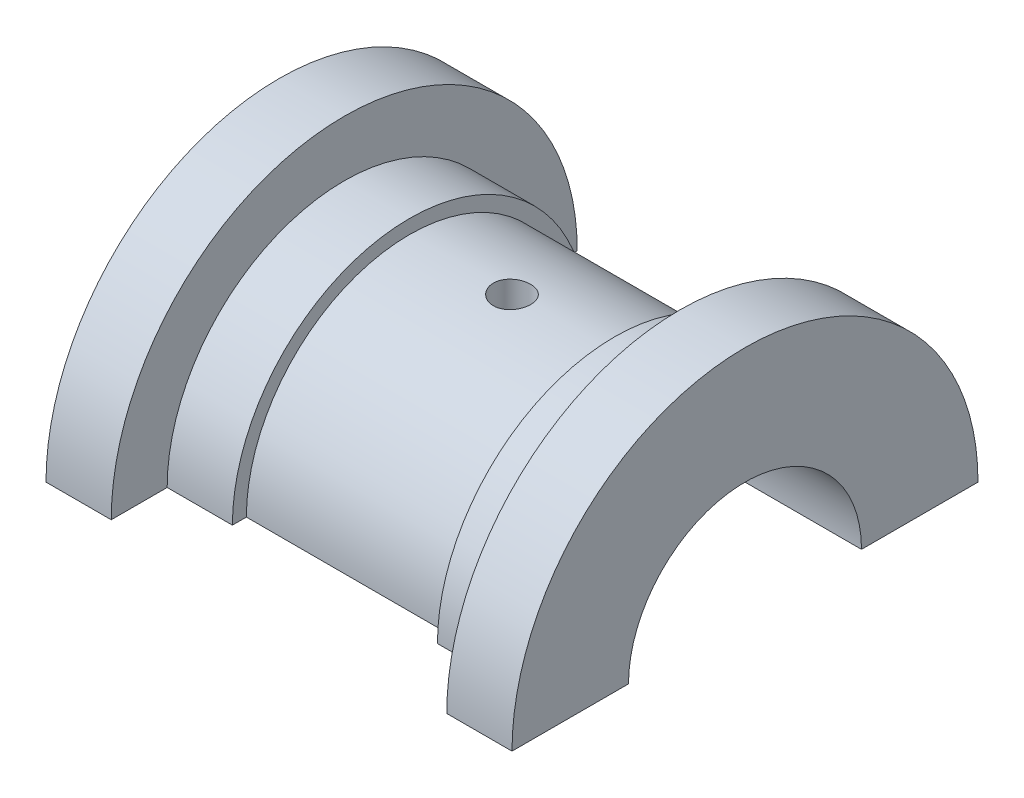
ISO-10303-21;
HEADER;
FILE_DESCRIPTION(('STEP AP214'),'2;1');
FILE_NAME('part.step','',(''),(''),'','','');
FILE_SCHEMA(('AUTOMOTIVE_DESIGN { 1 0 10303 214 1 1 1 1 }'));
ENDSEC;
DATA;
#1=APPLICATION_CONTEXT('core data for automotive mechanical design processes');
#2=APPLICATION_PROTOCOL_DEFINITION('international standard','automotive_design',2000,#1);
#3=PRODUCT_CONTEXT('',#1,'mechanical');
#4=PRODUCT('Part','Part','',(#3));
#5=PRODUCT_RELATED_PRODUCT_CATEGORY('part','',(#4));
#6=PRODUCT_DEFINITION_FORMATION('','',#4);
#7=PRODUCT_DEFINITION_CONTEXT('part definition',#1,'design');
#8=PRODUCT_DEFINITION('design','',#6,#7);
#9=PRODUCT_DEFINITION_SHAPE('','',#8);
#10=(LENGTH_UNIT() NAMED_UNIT(*) SI_UNIT(.MILLI.,.METRE.));
#11=(NAMED_UNIT(*) PLANE_ANGLE_UNIT() SI_UNIT($,.RADIAN.));
#12=(NAMED_UNIT(*) SI_UNIT($,.STERADIAN.) SOLID_ANGLE_UNIT());
#13=UNCERTAINTY_MEASURE_WITH_UNIT(LENGTH_MEASURE(1.E-05),#10,'distance_accuracy_value','');
#14=(GEOMETRIC_REPRESENTATION_CONTEXT(3) GLOBAL_UNCERTAINTY_ASSIGNED_CONTEXT((#13)) GLOBAL_UNIT_ASSIGNED_CONTEXT((#10,
#11,#12)) REPRESENTATION_CONTEXT('',''));
#15=CARTESIAN_POINT('',(0.,0.,0.));
#16=DIRECTION('',(0.,0.,1.));
#17=DIRECTION('',(1.,0.,0.));
#18=AXIS2_PLACEMENT_3D('',#15,#16,#17);
#19=CARTESIAN_POINT('',(25.,0.,0.));
#20=DIRECTION('',(-1.,0.,0.));
#21=DIRECTION('',(0.,0.,1.));
#22=AXIS2_PLACEMENT_3D('',#19,#20,#21);
#23=PLANE('',#22);
#24=CARTESIAN_POINT('',(25.,0.,0.));
#25=DIRECTION('',(-1.,0.,0.));
#26=DIRECTION('',(0.,0.,1.));
#27=AXIS2_PLACEMENT_3D('',#24,#25,#26);
#28=CIRCLE('',#27,25.);
#29=CARTESIAN_POINT('',(25.,0.,25.));
#30=VERTEX_POINT('',#29);
#31=CARTESIAN_POINT('',(25.,0.,-25.));
#32=VERTEX_POINT('',#31);
#33=EDGE_CURVE('E151',#30,#32,#28,.T.);
#34=ORIENTED_EDGE('',*,*,#33,.F.);
#35=DIRECTION('',(0.,0.,-1.));
#36=VECTOR('',#35,1.);
#37=CARTESIAN_POINT('',(25.,0.,0.));
#38=LINE('',#37,#36);
#39=CARTESIAN_POINT('',(25.,0.,12.5));
#40=VERTEX_POINT('',#39);
#41=EDGE_CURVE('E156',#30,#40,#38,.T.);
#42=ORIENTED_EDGE('',*,*,#41,.T.);
#43=CARTESIAN_POINT('',(25.,0.,0.));
#44=DIRECTION('',(1.,0.,0.));
#45=DIRECTION('',(0.,0.,-1.));
#46=AXIS2_PLACEMENT_3D('',#43,#44,#45);
#47=CIRCLE('',#46,12.5);
#48=CARTESIAN_POINT('',(25.,0.,-12.5));
#49=VERTEX_POINT('',#48);
#50=EDGE_CURVE('E153',#49,#40,#47,.T.);
#51=ORIENTED_EDGE('',*,*,#50,.F.);
#52=EDGE_CURVE('E64',#49,#32,#38,.T.);
#53=ORIENTED_EDGE('',*,*,#52,.T.);
#54=EDGE_LOOP('',(#34,#42,#51,#53));
#55=FACE_BOUND('',#54,.T.);
#56=ADVANCED_FACE('F43',(#55),#23,.F.);
#57=CARTESIAN_POINT('',(-25.,0.,0.));
#58=DIRECTION('',(-1.,0.,0.));
#59=DIRECTION('',(0.,0.,1.));
#60=AXIS2_PLACEMENT_3D('',#57,#58,#59);
#61=CYLINDRICAL_SURFACE('',#60,25.);
#62=ORIENTED_EDGE('',*,*,#33,.T.);
#63=DIRECTION('',(-1.,0.,0.));
#64=VECTOR('',#63,1.);
#65=CARTESIAN_POINT('',(133.253175473055,0.,-25.));
#66=LINE('',#65,#64);
#67=CARTESIAN_POINT('',(18.,0.,-25.));
#68=VERTEX_POINT('',#67);
#69=EDGE_CURVE('E135',#32,#68,#66,.T.);
#70=ORIENTED_EDGE('',*,*,#69,.T.);
#71=CARTESIAN_POINT('',(18.,0.,0.));
#72=DIRECTION('',(-1.,0.,0.));
#73=DIRECTION('',(0.,0.,1.));
#74=AXIS2_PLACEMENT_3D('',#71,#72,#73);
#75=CIRCLE('',#74,25.);
#76=CARTESIAN_POINT('',(18.,0.,25.));
#77=VERTEX_POINT('',#76);
#78=EDGE_CURVE('E161',#77,#68,#75,.T.);
#79=ORIENTED_EDGE('',*,*,#78,.F.);
#80=DIRECTION('',(-1.,0.,0.));
#81=VECTOR('',#80,1.);
#82=CARTESIAN_POINT('',(133.253175473055,0.,25.));
#83=LINE('',#82,#81);
#84=EDGE_CURVE('E159',#30,#77,#83,.T.);
#85=ORIENTED_EDGE('',*,*,#84,.F.);
#86=EDGE_LOOP('',(#62,#70,#79,#85));
#87=FACE_BOUND('',#86,.T.);
#88=ADVANCED_FACE('F158',(#87),#61,.T.);
#89=CARTESIAN_POINT('',(18.,25.,0.));
#90=DIRECTION('',(1.,0.,0.));
#91=DIRECTION('',(0.,0.,-1.));
#92=AXIS2_PLACEMENT_3D('',#89,#90,#91);
#93=PLANE('',#92);
#94=ORIENTED_EDGE('',*,*,#78,.T.);
#95=DIRECTION('',(0.,0.,1.));
#96=VECTOR('',#95,1.);
#97=CARTESIAN_POINT('',(18.,0.,0.));
#98=LINE('',#97,#96);
#99=CARTESIAN_POINT('',(18.,0.,-19.));
#100=VERTEX_POINT('',#99);
#101=EDGE_CURVE('E138',#68,#100,#98,.T.);
#102=ORIENTED_EDGE('',*,*,#101,.T.);
#103=CARTESIAN_POINT('',(18.,0.,0.));
#104=DIRECTION('',(-1.,0.,0.));
#105=DIRECTION('',(0.,0.,1.));
#106=AXIS2_PLACEMENT_3D('',#103,#104,#105);
#107=CIRCLE('',#106,19.);
#108=CARTESIAN_POINT('',(18.,0.,19.));
#109=VERTEX_POINT('',#108);
#110=EDGE_CURVE('E166',#109,#100,#107,.T.);
#111=ORIENTED_EDGE('',*,*,#110,.F.);
#112=EDGE_CURVE('E203',#109,#77,#98,.T.);
#113=ORIENTED_EDGE('',*,*,#112,.T.);
#114=EDGE_LOOP('',(#94,#102,#111,#113));
#115=FACE_BOUND('',#114,.T.);
#116=ADVANCED_FACE('F308',(#115),#93,.F.);
#117=CARTESIAN_POINT('',(-25.,0.,0.));
#118=DIRECTION('',(-1.,0.,0.));
#119=DIRECTION('',(0.,0.,1.));
#120=AXIS2_PLACEMENT_3D('',#117,#118,#119);
#121=CYLINDRICAL_SURFACE('',#120,19.);
#122=ORIENTED_EDGE('',*,*,#110,.T.);
#123=DIRECTION('',(-1.,0.,0.));
#124=VECTOR('',#123,1.);
#125=CARTESIAN_POINT('',(-25.,0.,-19.));
#126=LINE('',#125,#124);
#127=CARTESIAN_POINT('',(11.,0.,-19.));
#128=VERTEX_POINT('',#127);
#129=EDGE_CURVE('E224',#100,#128,#126,.T.);
#130=ORIENTED_EDGE('',*,*,#129,.T.);
#131=CARTESIAN_POINT('',(11.,0.,0.));
#132=DIRECTION('',(-1.,0.,0.));
#133=DIRECTION('',(0.,0.,1.));
#134=AXIS2_PLACEMENT_3D('',#131,#132,#133);
#135=CIRCLE('',#134,19.);
#136=CARTESIAN_POINT('',(11.,0.,19.));
#137=VERTEX_POINT('',#136);
#138=EDGE_CURVE('E172',#137,#128,#135,.T.);
#139=ORIENTED_EDGE('',*,*,#138,.F.);
#140=DIRECTION('',(-1.,0.,0.));
#141=VECTOR('',#140,1.);
#142=CARTESIAN_POINT('',(-25.,0.,19.));
#143=LINE('',#142,#141);
#144=EDGE_CURVE('E207',#137,#109,#143,.F.);
#145=ORIENTED_EDGE('',*,*,#144,.T.);
#146=EDGE_LOOP('',(#122,#130,#139,#145));
#147=FACE_BOUND('',#146,.T.);
#148=ADVANCED_FACE('F312',(#147),#121,.T.);
#149=CARTESIAN_POINT('',(11.,19.,0.));
#150=DIRECTION('',(1.,0.,0.));
#151=DIRECTION('',(0.,0.,-1.));
#152=AXIS2_PLACEMENT_3D('',#149,#150,#151);
#153=PLANE('',#152);
#154=ORIENTED_EDGE('',*,*,#138,.T.);
#155=DIRECTION('',(0.,0.,1.));
#156=VECTOR('',#155,1.);
#157=CARTESIAN_POINT('',(11.,0.,0.));
#158=LINE('',#157,#156);
#159=CARTESIAN_POINT('',(11.,0.,-17.5));
#160=VERTEX_POINT('',#159);
#161=EDGE_CURVE('E228',#128,#160,#158,.T.);
#162=ORIENTED_EDGE('',*,*,#161,.T.);
#163=CARTESIAN_POINT('',(11.,0.,0.));
#164=DIRECTION('',(-1.,0.,0.));
#165=DIRECTION('',(0.,0.,1.));
#166=AXIS2_PLACEMENT_3D('',#163,#164,#165);
#167=CIRCLE('',#166,17.5);
#168=CARTESIAN_POINT('',(11.,0.,17.5));
#169=VERTEX_POINT('',#168);
#170=EDGE_CURVE('E176',#169,#160,#167,.T.);
#171=ORIENTED_EDGE('',*,*,#170,.F.);
#172=EDGE_CURVE('E211',#169,#137,#158,.T.);
#173=ORIENTED_EDGE('',*,*,#172,.T.);
#174=EDGE_LOOP('',(#154,#162,#171,#173));
#175=FACE_BOUND('',#174,.T.);
#176=ADVANCED_FACE('F301',(#175),#153,.F.);
#177=CARTESIAN_POINT('',(-25.,0.,0.));
#178=DIRECTION('',(-1.,0.,0.));
#179=DIRECTION('',(0.,0.,1.));
#180=AXIS2_PLACEMENT_3D('',#177,#178,#179);
#181=CYLINDRICAL_SURFACE('',#180,17.5);
#182=CARTESIAN_POINT('',(0.,17.3853386507137,2.));
#183=CARTESIAN_POINT('',(-0.111946589372524,17.3853401353315,1.99999519733595));
#184=CARTESIAN_POINT('',(-0.223964994921923,17.3864315751054,1.99056928251642));
#185=CARTESIAN_POINT('',(-0.444889671697474,17.3906782331753,1.95311344773096));
#186=CARTESIAN_POINT('',(-0.553792479503966,17.3938356616542,1.92506360351944));
#187=CARTESIAN_POINT('',(-0.765255030279527,17.4018520931882,1.85119296589626));
#188=CARTESIAN_POINT('',(-0.867818819285595,17.4067099973959,1.80538364660709));
#189=CARTESIAN_POINT('',(-1.06378206604588,17.4175786814491,1.6973178849601));
#190=CARTESIAN_POINT('',(-1.15718320126785,17.423589249671,1.6350644608687));
#191=CARTESIAN_POINT('',(-1.33262956371172,17.4361176819346,1.49556368835386));
#192=CARTESIAN_POINT('',(-1.41462552791579,17.4426375676046,1.41825455823809));
#193=CARTESIAN_POINT('',(-1.56450902249383,17.4554317583341,1.25096954824277));
#194=CARTESIAN_POINT('',(-1.63239587710581,17.4617060516193,1.16099306200071));
#195=CARTESIAN_POINT('',(-1.75230824059131,17.4733225280882,0.970620910263635));
#196=CARTESIAN_POINT('',(-1.80428955803743,17.4786620969871,0.870197236204718));
#197=CARTESIAN_POINT('',(-1.89063240605875,17.4877853680334,0.66197497320992));
#198=CARTESIAN_POINT('',(-1.9249944880326,17.4915691188697,0.554176615186415));
#199=CARTESIAN_POINT('',(-1.97497734252851,17.4971402074226,0.334766558288023));
#200=CARTESIAN_POINT('',(-1.99067964857446,17.4989362281041,0.223173657194598));
#201=CARTESIAN_POINT('',(-2.00314972142082,17.5003590938998,-0.00107691382555894));
#202=CARTESIAN_POINT('',(-1.99991811760643,17.4999860111176,-0.11373454823503));
#203=CARTESIAN_POINT('',(-1.9746778272773,17.497119767547,-0.33636248784968));
#204=CARTESIAN_POINT('',(-1.95275682041612,17.4946365066491,-0.44634287900327));
#205=CARTESIAN_POINT('',(-1.89089682950376,17.487840154992,-0.661053445479786));
#206=CARTESIAN_POINT('',(-1.85095755129325,17.4835270343592,-0.765783535057301));
#207=CARTESIAN_POINT('',(-1.75410019097594,17.4735386514763,-0.967294288035754));
#208=CARTESIAN_POINT('',(-1.69714377600709,17.4678603196472,-1.06405636819045));
#209=CARTESIAN_POINT('',(-1.56789678444337,17.4557776619181,-1.24668163917683));
#210=CARTESIAN_POINT('',(-1.49560561983236,17.449373308183,-1.33254441186903));
#211=CARTESIAN_POINT('',(-1.33724919448781,17.436513040988,-1.49144815236604));
#212=CARTESIAN_POINT('',(-1.25110758210007,17.4300570420279,-1.56441304576845));
#213=CARTESIAN_POINT('',(-1.0677588923309,17.4178574111694,-1.69485961446738));
#214=CARTESIAN_POINT('',(-0.970551789715114,17.4121137808956,-1.75234125445402));
#215=CARTESIAN_POINT('',(-0.767767939743451,17.4019890438088,-1.85019181534949));
#216=CARTESIAN_POINT('',(-0.662188535919723,17.3976083716403,-1.89055527879404));
#217=CARTESIAN_POINT('',(-0.445689423466888,17.3907142897617,-1.95295957446188));
#218=CARTESIAN_POINT('',(-0.334769928945009,17.3882008052541,-1.97500114064275));
#219=CARTESIAN_POINT('',(-0.111409276007052,17.3853390699854,-2.00003653434785));
#220=CARTESIAN_POINT('',(0.00101976549901354,17.384978682311,-2.00313713351255));
#221=CARTESIAN_POINT('',(0.224795725911944,17.3864318824203,-1.99048370024868));
#222=CARTESIAN_POINT('',(0.336142663982755,17.3882454316329,-1.97473000234356));
#223=CARTESIAN_POINT('',(0.554277710431837,17.3938311078367,-1.92490480743124));
#224=CARTESIAN_POINT('',(0.661077653557209,17.3975977651037,-1.89088445720912));
#225=CARTESIAN_POINT('',(0.867456208856069,17.4066608217964,-1.8055441206904));
#226=CARTESIAN_POINT('',(0.967034606989831,17.4119572665405,-1.75422362188829));
#227=CARTESIAN_POINT('',(1.15662812006314,17.4235123453982,-1.63547501760195));
#228=CARTESIAN_POINT('',(1.24659891285623,17.4297751382952,-1.56797655870491));
#229=CARTESIAN_POINT('',(1.41397230825862,17.442543959092,-1.41888814821184));
#230=CARTESIAN_POINT('',(1.49137450327603,17.4490499948718,-1.33729773979956));
#231=CARTESIAN_POINT('',(1.63178548317454,17.4616092377758,-1.16187651855541));
#232=CARTESIAN_POINT('',(1.69472433770165,17.4676601534551,-1.06798954470542));
#233=CARTESIAN_POINT('',(1.80393937919364,17.4785935486018,-0.870915351390361));
#234=CARTESIAN_POINT('',(1.8502158540187,17.4834760482544,-0.76772829263257));
#235=CARTESIAN_POINT('',(1.92467566123988,17.4915122431867,-0.555220730050709));
#236=CARTESIAN_POINT('',(1.95290023506191,17.4946698766728,-0.445914831710694));
#237=CARTESIAN_POINT('',(1.99058941951927,17.498916830849,-0.224077216219368));
#238=CARTESIAN_POINT('',(2.00005473054384,17.5000062287579,-0.111545619660739));
#239=CARTESIAN_POINT('',(1.99994510250234,17.4999937520126,0.112864401253133));
#240=CARTESIAN_POINT('',(1.99047832045056,17.4989043247502,0.224742894695049));
#241=CARTESIAN_POINT('',(1.95300127134245,17.4946812487719,0.445308378800854));
#242=CARTESIAN_POINT('',(1.92499100344009,17.4915475999627,0.553995369319134));
#243=CARTESIAN_POINT('',(1.85125428527817,17.4835868311737,0.765084431079245));
#244=CARTESIAN_POINT('',(1.80553211653411,17.478760120486,0.867488014290727));
#245=CARTESIAN_POINT('',(1.69768073352085,17.4679493137143,1.0631853726956));
#246=CARTESIAN_POINT('',(1.63555145524283,17.4619652131149,1.15647911234695));
#247=CARTESIAN_POINT('',(1.49624648821104,17.4494678477128,1.33186210611053));
#248=CARTESIAN_POINT('',(1.41899021819487,17.4429518630308,1.41388716420689));
#249=CARTESIAN_POINT('',(1.25178901681435,17.4301475365176,1.5638533009412));
#250=CARTESIAN_POINT('',(1.16184106815131,17.4238592492669,1.63179102096622));
#251=CARTESIAN_POINT('',(0.971480376349264,17.4122005213082,1.75183717616198));
#252=CARTESIAN_POINT('',(0.87103460063765,17.4068331273112,1.80389349456594));
#253=CARTESIAN_POINT('',(0.662825662631923,17.3976597913728,1.89032803888977));
#254=CARTESIAN_POINT('',(0.555070743865215,17.3938521233529,1.92472581745879));
#255=CARTESIAN_POINT('',(0.372277873121076,17.3891702575432,1.96647476380521));
#256=CARTESIAN_POINT('',(0.298400454831266,17.3877403947785,1.9790290620281));
#257=CARTESIAN_POINT('',(0.149692726088288,17.3858240977585,1.99579326119775));
#258=CARTESIAN_POINT('',(0.0748624212969904,17.3853376579002,2.00000321170177));
#259=CARTESIAN_POINT('',(0.,17.3853386507137,2.));
#260=B_SPLINE_CURVE_WITH_KNOTS('',3,(#182,#183,#184,#185,#186,#187,#188,#189,#190,#191,#192,
#193,#194,#195,#196,#197,#198,#199,#200,#201,#202,#203,#204,#205,#206,#207,#208,#209,#210,#211,
#212,#213,#214,#215,#216,#217,#218,#219,#220,#221,#222,#223,#224,#225,#226,#227,#228,#229,#230,
#231,#232,#233,#234,#235,#236,#237,#238,#239,#240,#241,#242,#243,#244,#245,#246,#247,#248,#249,
#250,#251,#252,#253,#254,#255,#256,#257,#258,#259),.UNSPECIFIED.,.T.,.F.,(4,2,2,2,2,2,2,2,2,2,2,
2,2,2,2,2,2,2,2,2,2,2,2,2,2,2,2,2,2,2,2,2,2,2,2,2,2,2,4),(0.,0.335566330669862,
0.671492236482426,1.00720146648589,1.34284912082551,1.67990430025881,2.01697561937898,
2.35497511648652,2.69296403516427,3.02947062308711,3.36596602520247,3.7008914215613,
4.03582228598058,4.3715133792636,4.70721734706225,5.04483970261994,5.3824628281258,
5.72019351085555,6.05791066376697,6.39372230997641,6.72952799811684,7.06439829362763,
7.3992785103225,7.73564232927687,8.07201705412562,8.40998545131677,8.74794800946722,
9.08513567305447,9.42231074728433,9.75756507912587,10.0928194262631,10.4279927825518,
10.7631674464669,11.1001786972192,11.4372702038874,11.7754563049136,12.113267132881,
12.3376728727777,12.5620772799195),.UNSPECIFIED.);
#261=CARTESIAN_POINT('',(0.,17.3853386507137,2.));
#262=VERTEX_POINT('',#261);
#263=EDGE_CURVE('E253',#262,#262,#260,.T.);
#264=ORIENTED_EDGE('',*,*,#263,.T.);
#265=EDGE_LOOP('',(#264));
#266=FACE_BOUND('',#265,.T.);
#267=ORIENTED_EDGE('',*,*,#170,.T.);
#268=DIRECTION('',(-1.,0.,0.));
#269=VECTOR('',#268,1.);
#270=CARTESIAN_POINT('',(-25.,0.,-17.5));
#271=LINE('',#270,#269);
#272=CARTESIAN_POINT('',(-11.,0.,-17.5));
#273=VERTEX_POINT('',#272);
#274=EDGE_CURVE('E232',#160,#273,#271,.T.);
#275=ORIENTED_EDGE('',*,*,#274,.T.);
#276=CARTESIAN_POINT('',(-11.,0.,0.));
#277=DIRECTION('',(-1.,0.,0.));
#278=DIRECTION('',(0.,0.,1.));
#279=AXIS2_PLACEMENT_3D('',#276,#277,#278);
#280=CIRCLE('',#279,17.5);
#281=CARTESIAN_POINT('',(-11.,0.,17.5));
#282=VERTEX_POINT('',#281);
#283=EDGE_CURVE('E180',#282,#273,#280,.T.);
#284=ORIENTED_EDGE('',*,*,#283,.F.);
#285=DIRECTION('',(-1.,0.,0.));
#286=VECTOR('',#285,1.);
#287=CARTESIAN_POINT('',(-25.,0.,17.5));
#288=LINE('',#287,#286);
#289=EDGE_CURVE('E212',#282,#169,#288,.F.);
#290=ORIENTED_EDGE('',*,*,#289,.T.);
#291=EDGE_LOOP('',(#267,#275,#284,#290));
#292=FACE_BOUND('',#291,.T.);
#293=ADVANCED_FACE('F263',(#266,#292),#181,.T.);
#294=CARTESIAN_POINT('',(-11.,19.,0.));
#295=DIRECTION('',(-1.,0.,0.));
#296=DIRECTION('',(0.,0.,1.));
#297=AXIS2_PLACEMENT_3D('',#294,#295,#296);
#298=PLANE('',#297);
#299=CARTESIAN_POINT('',(-11.,0.,0.));
#300=DIRECTION('',(-1.,0.,0.));
#301=DIRECTION('',(0.,0.,1.));
#302=AXIS2_PLACEMENT_3D('',#299,#300,#301);
#303=CIRCLE('',#302,19.);
#304=CARTESIAN_POINT('',(-11.,0.,19.));
#305=VERTEX_POINT('',#304);
#306=CARTESIAN_POINT('',(-11.,0.,-19.));
#307=VERTEX_POINT('',#306);
#308=EDGE_CURVE('E184',#305,#307,#303,.T.);
#309=ORIENTED_EDGE('',*,*,#308,.F.);
#310=DIRECTION('',(0.,0.,-1.));
#311=VECTOR('',#310,1.);
#312=CARTESIAN_POINT('',(-11.,0.,0.));
#313=LINE('',#312,#311);
#314=EDGE_CURVE('E216',#305,#282,#313,.T.);
#315=ORIENTED_EDGE('',*,*,#314,.T.);
#316=ORIENTED_EDGE('',*,*,#283,.T.);
#317=EDGE_CURVE('E236',#273,#307,#313,.T.);
#318=ORIENTED_EDGE('',*,*,#317,.T.);
#319=EDGE_LOOP('',(#309,#315,#316,#318));
#320=FACE_BOUND('',#319,.T.);
#321=ADVANCED_FACE('F294',(#320),#298,.F.);
#322=CARTESIAN_POINT('',(-25.,0.,0.));
#323=DIRECTION('',(-1.,0.,0.));
#324=DIRECTION('',(0.,0.,1.));
#325=AXIS2_PLACEMENT_3D('',#322,#323,#324);
#326=CYLINDRICAL_SURFACE('',#325,19.);
#327=ORIENTED_EDGE('',*,*,#308,.T.);
#328=DIRECTION('',(-1.,0.,0.));
#329=VECTOR('',#328,1.);
#330=CARTESIAN_POINT('',(-25.,0.,-19.));
#331=LINE('',#330,#329);
#332=CARTESIAN_POINT('',(-18.,0.,-19.));
#333=VERTEX_POINT('',#332);
#334=EDGE_CURVE('E240',#307,#333,#331,.T.);
#335=ORIENTED_EDGE('',*,*,#334,.T.);
#336=CARTESIAN_POINT('',(-18.,0.,0.));
#337=DIRECTION('',(-1.,0.,0.));
#338=DIRECTION('',(0.,0.,1.));
#339=AXIS2_PLACEMENT_3D('',#336,#337,#338);
#340=CIRCLE('',#339,19.);
#341=CARTESIAN_POINT('',(-18.,0.,19.));
#342=VERTEX_POINT('',#341);
#343=EDGE_CURVE('E188',#342,#333,#340,.T.);
#344=ORIENTED_EDGE('',*,*,#343,.F.);
#345=DIRECTION('',(-1.,0.,0.));
#346=VECTOR('',#345,1.);
#347=CARTESIAN_POINT('',(-25.,0.,19.));
#348=LINE('',#347,#346);
#349=EDGE_CURVE('E217',#342,#305,#348,.F.);
#350=ORIENTED_EDGE('',*,*,#349,.T.);
#351=EDGE_LOOP('',(#327,#335,#344,#350));
#352=FACE_BOUND('',#351,.T.);
#353=ADVANCED_FACE('F291',(#352),#326,.T.);
#354=CARTESIAN_POINT('',(-18.,25.,0.));
#355=DIRECTION('',(-1.,0.,0.));
#356=DIRECTION('',(0.,0.,1.));
#357=AXIS2_PLACEMENT_3D('',#354,#355,#356);
#358=PLANE('',#357);
#359=CARTESIAN_POINT('',(-18.,0.,0.));
#360=DIRECTION('',(-1.,0.,0.));
#361=DIRECTION('',(0.,0.,1.));
#362=AXIS2_PLACEMENT_3D('',#359,#360,#361);
#363=CIRCLE('',#362,25.);
#364=CARTESIAN_POINT('',(-18.,0.,25.));
#365=VERTEX_POINT('',#364);
#366=CARTESIAN_POINT('',(-18.,0.,-25.));
#367=VERTEX_POINT('',#366);
#368=EDGE_CURVE('E192',#365,#367,#363,.T.);
#369=ORIENTED_EDGE('',*,*,#368,.F.);
#370=DIRECTION('',(0.,0.,-1.));
#371=VECTOR('',#370,1.);
#372=CARTESIAN_POINT('',(-18.,0.,0.));
#373=LINE('',#372,#371);
#374=EDGE_CURVE('E221',#365,#342,#373,.T.);
#375=ORIENTED_EDGE('',*,*,#374,.T.);
#376=ORIENTED_EDGE('',*,*,#343,.T.);
#377=EDGE_CURVE('E244',#333,#367,#373,.T.);
#378=ORIENTED_EDGE('',*,*,#377,.T.);
#379=EDGE_LOOP('',(#369,#375,#376,#378));
#380=FACE_BOUND('',#379,.T.);
#381=ADVANCED_FACE('F287',(#380),#358,.F.);
#382=CARTESIAN_POINT('',(-25.,0.,0.));
#383=DIRECTION('',(-1.,0.,0.));
#384=DIRECTION('',(0.,0.,1.));
#385=AXIS2_PLACEMENT_3D('',#382,#383,#384);
#386=CYLINDRICAL_SURFACE('',#385,25.);
#387=ORIENTED_EDGE('',*,*,#368,.T.);
#388=CARTESIAN_POINT('',(-25.,0.,-25.));
#389=VERTEX_POINT('',#388);
#390=EDGE_CURVE('E145',#367,#389,#66,.T.);
#391=ORIENTED_EDGE('',*,*,#390,.T.);
#392=CARTESIAN_POINT('',(-25.,0.,0.));
#393=DIRECTION('',(-1.,0.,0.));
#394=DIRECTION('',(0.,0.,1.));
#395=AXIS2_PLACEMENT_3D('',#392,#393,#394);
#396=CIRCLE('',#395,25.);
#397=CARTESIAN_POINT('',(-25.,0.,25.));
#398=VERTEX_POINT('',#397);
#399=EDGE_CURVE('E196',#398,#389,#396,.T.);
#400=ORIENTED_EDGE('',*,*,#399,.F.);
#401=EDGE_CURVE('E251',#365,#398,#83,.T.);
#402=ORIENTED_EDGE('',*,*,#401,.F.);
#403=EDGE_LOOP('',(#387,#391,#400,#402));
#404=FACE_BOUND('',#403,.T.);
#405=ADVANCED_FACE('F283',(#404),#386,.T.);
#406=CARTESIAN_POINT('',(-25.,0.,0.));
#407=DIRECTION('',(1.,0.,0.));
#408=DIRECTION('',(0.,0.,-1.));
#409=AXIS2_PLACEMENT_3D('',#406,#407,#408);
#410=PLANE('',#409);
#411=ORIENTED_EDGE('',*,*,#399,.T.);
#412=DIRECTION('',(0.,0.,1.));
#413=VECTOR('',#412,1.);
#414=CARTESIAN_POINT('',(-25.,0.,0.));
#415=LINE('',#414,#413);
#416=CARTESIAN_POINT('',(-25.,0.,-12.5));
#417=VERTEX_POINT('',#416);
#418=EDGE_CURVE('E144',#389,#417,#415,.T.);
#419=ORIENTED_EDGE('',*,*,#418,.T.);
#420=CARTESIAN_POINT('',(-25.,0.,0.));
#421=DIRECTION('',(1.,0.,0.));
#422=DIRECTION('',(0.,0.,-1.));
#423=AXIS2_PLACEMENT_3D('',#420,#421,#422);
#424=CIRCLE('',#423,12.5);
#425=CARTESIAN_POINT('',(-25.,0.,12.5));
#426=VERTEX_POINT('',#425);
#427=EDGE_CURVE('E200',#417,#426,#424,.T.);
#428=ORIENTED_EDGE('',*,*,#427,.T.);
#429=EDGE_CURVE('E72',#426,#398,#415,.T.);
#430=ORIENTED_EDGE('',*,*,#429,.T.);
#431=EDGE_LOOP('',(#411,#419,#428,#430));
#432=FACE_BOUND('',#431,.T.);
#433=ADVANCED_FACE('F279',(#432),#410,.F.);
#434=CARTESIAN_POINT('',(-25.,0.,0.));
#435=DIRECTION('',(1.,0.,0.));
#436=DIRECTION('',(0.,0.,-1.));
#437=AXIS2_PLACEMENT_3D('',#434,#435,#436);
#438=CYLINDRICAL_SURFACE('',#437,12.5);
#439=CARTESIAN_POINT('',(0.,12.3389626792531,2.));
#440=CARTESIAN_POINT('',(0.111566715369601,12.3389646365747,1.99999546268269));
#441=CARTESIAN_POINT('',(0.223195940876382,12.3404922170901,1.99063305520352));
#442=CARTESIAN_POINT('',(0.443326847344627,12.3464325117521,1.95344445500885));
#443=CARTESIAN_POINT('',(0.551825474504615,12.3508479497636,1.92560083019994));
#444=CARTESIAN_POINT('',(0.762477313101267,12.3620513503607,1.85230972937127));
#445=CARTESIAN_POINT('',(0.864635571645263,12.3688373965941,1.8068764692589));
#446=CARTESIAN_POINT('',(1.05986648038844,12.3840151290006,1.69973041648431));
#447=CARTESIAN_POINT('',(1.15294024493589,12.3924066178675,1.63801962395043));
#448=CARTESIAN_POINT('',(1.32821893279529,12.409935008592,1.4994714023648));
#449=CARTESIAN_POINT('',(1.41032926550982,12.4190774196954,1.42251498707585));
#450=CARTESIAN_POINT('',(1.56052945966013,12.4370285016078,1.25591709815232));
#451=CARTESIAN_POINT('',(1.62861851530075,12.4458371532121,1.16627489597169));
#452=CARTESIAN_POINT('',(1.7491959612917,12.4621862608068,0.976239917029318));
#453=CARTESIAN_POINT('',(1.80159669033811,12.4697194921289,0.875790844473845));
#454=CARTESIAN_POINT('',(1.88874693905998,12.4826077762261,0.667375995890959));
#455=CARTESIAN_POINT('',(1.92349751749068,12.4879629596488,0.559410671172466));
#456=CARTESIAN_POINT('',(1.97407274436243,12.4958528816707,0.340004128946068));
#457=CARTESIAN_POINT('',(1.99005611940511,12.49841126176,0.228600363359407));
#458=CARTESIAN_POINT('',(2.00313650808571,12.500500461766,0.00466480752225198));
#459=CARTESIAN_POINT('',(2.00023470914493,12.5000314720312,-0.10786691136301));
#460=CARTESIAN_POINT('',(1.97575151431498,12.4961375614702,-0.329779715978531));
#461=CARTESIAN_POINT('',(1.95434091575268,12.4927396690852,-0.439180187321414));
#462=CARTESIAN_POINT('',(1.89371648537535,12.4833998597574,-0.652815342747673));
#463=CARTESIAN_POINT('',(1.85450214519059,12.4774578701704,-0.757049879228181));
#464=CARTESIAN_POINT('',(1.75921154129989,12.4636513003451,-0.957905986409038));
#465=CARTESIAN_POINT('',(1.70306427260419,12.4557786507463,-1.05449329349384));
#466=CARTESIAN_POINT('',(1.57555357138301,12.4389865614945,-1.23693967157033));
#467=CARTESIAN_POINT('',(1.50418900182922,12.4300670436423,-1.32279794013346));
#468=CARTESIAN_POINT('',(1.34732043643976,12.4120565702159,-1.48235721573536));
#469=CARTESIAN_POINT('',(1.2616672241591,12.4029648129688,-1.555911508216));
#470=CARTESIAN_POINT('',(1.07915724372807,12.3857313850728,-1.68762680827441));
#471=CARTESIAN_POINT('',(0.982300387310595,12.3775897219101,-1.74578769456446));
#472=CARTESIAN_POINT('',(0.779969490042988,12.3631781549851,-1.84509031627292));
#473=CARTESIAN_POINT('',(0.674487164843649,12.3569100782548,-1.88621545421919));
#474=CARTESIAN_POINT('',(0.457989378356676,12.3469864391895,-1.95012354011945));
#475=CARTESIAN_POINT('',(0.346974364635672,12.343330665898,-1.97290796919511));
#476=CARTESIAN_POINT('',(0.123872177326534,12.3390860491727,-1.99928349997629));
#477=CARTESIAN_POINT('',(0.01181028531563,12.338463865144,-2.00308326374921));
#478=CARTESIAN_POINT('',(-0.211348966265646,12.3402681873056,-1.99193667548245));
#479=CARTESIAN_POINT('',(-0.322446359912494,12.3426945853421,-1.97699098847046));
#480=CARTESIAN_POINT('',(-0.539866905444395,12.3502919469979,-1.92895527704861));
#481=CARTESIAN_POINT('',(-0.646213923180768,12.3554469800096,-1.89597053344241));
#482=CARTESIAN_POINT('',(-0.85187038701668,12.3679074973821,-1.81290306911356));
#483=CARTESIAN_POINT('',(-0.951179441681865,12.3752131012361,-1.76281939829005));
#484=CARTESIAN_POINT('',(-1.14087239308146,12.3912295180301,-1.64647965217412));
#485=CARTESIAN_POINT('',(-1.23117295357006,12.3999517832886,-1.58008930093855));
#486=CARTESIAN_POINT('',(-1.39942606063674,12.4177848415153,-1.43320604247695));
#487=CARTESIAN_POINT('',(-1.47737780864004,12.426895659562,-1.35271222391417));
#488=CARTESIAN_POINT('',(-1.61947729209286,12.4445842082074,-1.17898475488122));
#489=CARTESIAN_POINT('',(-1.68348622911078,12.4531560233311,-1.08563688229299));
#490=CARTESIAN_POINT('',(-1.7949130459885,12.4687070996718,-0.889391847388558));
#491=CARTESIAN_POINT('',(-1.8423314293228,12.4756864092145,-0.786494974976326));
#492=CARTESIAN_POINT('',(-1.91901272401869,12.4872402999743,-0.57449377709434));
#493=CARTESIAN_POINT('',(-1.94834960623599,12.4918246669271,-0.465416763098579));
#494=CARTESIAN_POINT('',(-1.98827383639251,12.4981133908354,-0.243805255219827));
#495=CARTESIAN_POINT('',(-1.99886260115402,12.4998179654206,-0.131271023257731));
#496=CARTESIAN_POINT('',(-2.00095179807928,12.5001523384762,0.0927181607457113));
#497=CARTESIAN_POINT('',(-1.99266389940292,12.4988162330541,0.204171144782975));
#498=CARTESIAN_POINT('',(-1.95769116172815,12.4932886224694,0.424076331137223));
#499=CARTESIAN_POINT('',(-1.93100640664942,12.4890971303321,0.532528547140255));
#500=CARTESIAN_POINT('',(-1.86007617517217,12.4783277894448,0.743282123112945));
#501=CARTESIAN_POINT('',(-1.81584732795195,12.471752200968,0.845589202324673));
#502=CARTESIAN_POINT('',(-1.71110753962108,12.4569342995937,1.0413631983055));
#503=CARTESIAN_POINT('',(-1.65059592553781,12.4486919178104,1.13482974947654));
#504=CARTESIAN_POINT('',(-1.51425167961562,12.4313454639236,1.31133889146831));
#505=CARTESIAN_POINT('',(-1.4382634970135,12.4222331866072,1.39426053318836));
#506=CARTESIAN_POINT('',(-1.27345013113633,12.4042323453373,1.54625119082762));
#507=CARTESIAN_POINT('',(-1.18462194427879,12.3953438343009,1.61531695647598));
#508=CARTESIAN_POINT('',(-0.995970826081013,12.3787350502446,1.73804191736152));
#509=CARTESIAN_POINT('',(-0.896080549743534,12.3710226983478,1.79159866107389));
#510=CARTESIAN_POINT('',(-0.688641710336669,12.35773272045,1.88109182389773));
#511=CARTESIAN_POINT('',(-0.581101048458822,12.3521529288763,1.91704612842095));
#512=CARTESIAN_POINT('',(-0.394262041879369,12.3450187006154,1.96235985662764));
#513=CARTESIAN_POINT('',(-0.316104706528517,12.3427600761638,1.97645270113688));
#514=CARTESIAN_POINT('',(-0.158642105439383,12.339731381368,1.99527431170452));
#515=CARTESIAN_POINT('',(-0.0793368579618941,12.3389612873707,2.00000322655819));
#516=CARTESIAN_POINT('',(0.,12.3389626792531,2.));
#517=B_SPLINE_CURVE_WITH_KNOTS('',3,(#439,#440,#441,#442,#443,#444,#445,#446,#447,#448,#449,
#450,#451,#452,#453,#454,#455,#456,#457,#458,#459,#460,#461,#462,#463,#464,#465,#466,#467,#468,
#469,#470,#471,#472,#473,#474,#475,#476,#477,#478,#479,#480,#481,#482,#483,#484,#485,#486,#487,
#488,#489,#490,#491,#492,#493,#494,#495,#496,#497,#498,#499,#500,#501,#502,#503,#504,#505,#506,
#507,#508,#509,#510,#511,#512,#513,#514,#515,#516),.UNSPECIFIED.,.T.,.F.,(4,2,2,2,2,2,2,2,2,2,2,
2,2,2,2,2,2,2,2,2,2,2,2,2,2,2,2,2,2,2,2,2,2,2,2,2,2,2,4),(0.,0.334410082462096,0.66913604063283,
1.00359203680449,1.33800695527949,1.6751426933581,2.01229780104021,2.35130309503299,
2.69028805118043,3.02638485112865,3.36246051891023,3.69546762348862,4.0284842373816,
4.36291718178071,4.69737512358616,5.03557384337791,5.37377522782556,5.71230534220323,
6.05080811551122,6.3855820633356,6.72034413480418,7.05317297710997,7.38602031604107,
7.7217061792982,8.05741374188327,8.39632425403564,8.73522448035856,9.07272891067331,
9.41020783420237,9.74392117047707,10.0776329844848,10.4110292424998,10.7444392820194,
11.0813822106389,11.4184040861632,11.7576040091322,12.0964585602663,12.3342666441618,
12.5720709491951),.UNSPECIFIED.);
#518=CARTESIAN_POINT('',(0.,12.3389626792531,2.));
#519=VERTEX_POINT('',#518);
#520=EDGE_CURVE('E46',#519,#519,#517,.T.);
#521=ORIENTED_EDGE('',*,*,#520,.T.);
#522=EDGE_LOOP('',(#521));
#523=FACE_BOUND('',#522,.T.);
#524=ORIENTED_EDGE('',*,*,#50,.T.);
#525=DIRECTION('',(1.,0.,0.));
#526=VECTOR('',#525,1.);
#527=CARTESIAN_POINT('',(-25.,0.,12.5));
#528=LINE('',#527,#526);
#529=EDGE_CURVE('E11',#40,#426,#528,.F.);
#530=ORIENTED_EDGE('',*,*,#529,.T.);
#531=ORIENTED_EDGE('',*,*,#427,.F.);
#532=DIRECTION('',(1.,0.,0.));
#533=VECTOR('',#532,1.);
#534=CARTESIAN_POINT('',(-25.,0.,-12.5));
#535=LINE('',#534,#533);
#536=EDGE_CURVE('E57',#417,#49,#535,.T.);
#537=ORIENTED_EDGE('',*,*,#536,.T.);
#538=EDGE_LOOP('',(#524,#530,#531,#537));
#539=FACE_BOUND('',#538,.T.);
#540=ADVANCED_FACE('F275',(#523,#539),#438,.F.);
#541=CARTESIAN_POINT('',(133.253175473055,0.,25.));
#542=DIRECTION('',(0.,1.,0.));
#543=DIRECTION('',(0.,0.,1.));
#544=AXIS2_PLACEMENT_3D('',#541,#542,#543);
#545=PLANE('',#544);
#546=ORIENTED_EDGE('',*,*,#101,.F.);
#547=ORIENTED_EDGE('',*,*,#69,.F.);
#548=ORIENTED_EDGE('',*,*,#52,.F.);
#549=ORIENTED_EDGE('',*,*,#536,.F.);
#550=ORIENTED_EDGE('',*,*,#418,.F.);
#551=ORIENTED_EDGE('',*,*,#390,.F.);
#552=ORIENTED_EDGE('',*,*,#377,.F.);
#553=ORIENTED_EDGE('',*,*,#334,.F.);
#554=ORIENTED_EDGE('',*,*,#317,.F.);
#555=ORIENTED_EDGE('',*,*,#274,.F.);
#556=ORIENTED_EDGE('',*,*,#161,.F.);
#557=ORIENTED_EDGE('',*,*,#129,.F.);
#558=EDGE_LOOP('',(#546,#547,#548,#549,#550,#551,#552,#553,#554,#555,#556,#557));
#559=FACE_BOUND('',#558,.T.);
#560=ADVANCED_FACE('F136',(#559),#545,.F.);
#561=ORIENTED_EDGE('',*,*,#112,.F.);
#562=ORIENTED_EDGE('',*,*,#144,.F.);
#563=ORIENTED_EDGE('',*,*,#172,.F.);
#564=ORIENTED_EDGE('',*,*,#289,.F.);
#565=ORIENTED_EDGE('',*,*,#314,.F.);
#566=ORIENTED_EDGE('',*,*,#349,.F.);
#567=ORIENTED_EDGE('',*,*,#374,.F.);
#568=ORIENTED_EDGE('',*,*,#401,.T.);
#569=ORIENTED_EDGE('',*,*,#429,.F.);
#570=ORIENTED_EDGE('',*,*,#529,.F.);
#571=ORIENTED_EDGE('',*,*,#41,.F.);
#572=ORIENTED_EDGE('',*,*,#84,.T.);
#573=EDGE_LOOP('',(#561,#562,#563,#564,#565,#566,#567,#568,#569,#570,#571,#572));
#574=FACE_BOUND('',#573,.T.);
#575=ADVANCED_FACE('F271',(#574),#545,.F.);
#576=CARTESIAN_POINT('',(0.,0.,0.));
#577=DIRECTION('',(0.,1.,0.));
#578=DIRECTION('',(0.,0.,1.));
#579=AXIS2_PLACEMENT_3D('',#576,#577,#578);
#580=CYLINDRICAL_SURFACE('',#579,2.);
#581=ORIENTED_EDGE('',*,*,#520,.F.);
#582=EDGE_LOOP('',(#581));
#583=FACE_BOUND('',#582,.T.);
#584=ORIENTED_EDGE('',*,*,#263,.F.);
#585=EDGE_LOOP('',(#584));
#586=FACE_BOUND('',#585,.T.);
#587=ADVANCED_FACE('F267',(#583,#586),#580,.F.);
#588=CLOSED_SHELL('',(#56,#88,#116,#148,#176,#293,#321,#353,#381,#405,#433,#540,#560,#575,#587));
#589=MANIFOLD_SOLID_BREP('B2',#588);
#590=ADVANCED_BREP_SHAPE_REPRESENTATION('',(#18,#589),#14);
#591=SHAPE_DEFINITION_REPRESENTATION(#9,#590);
ENDSEC;
END-ISO-10303-21;
